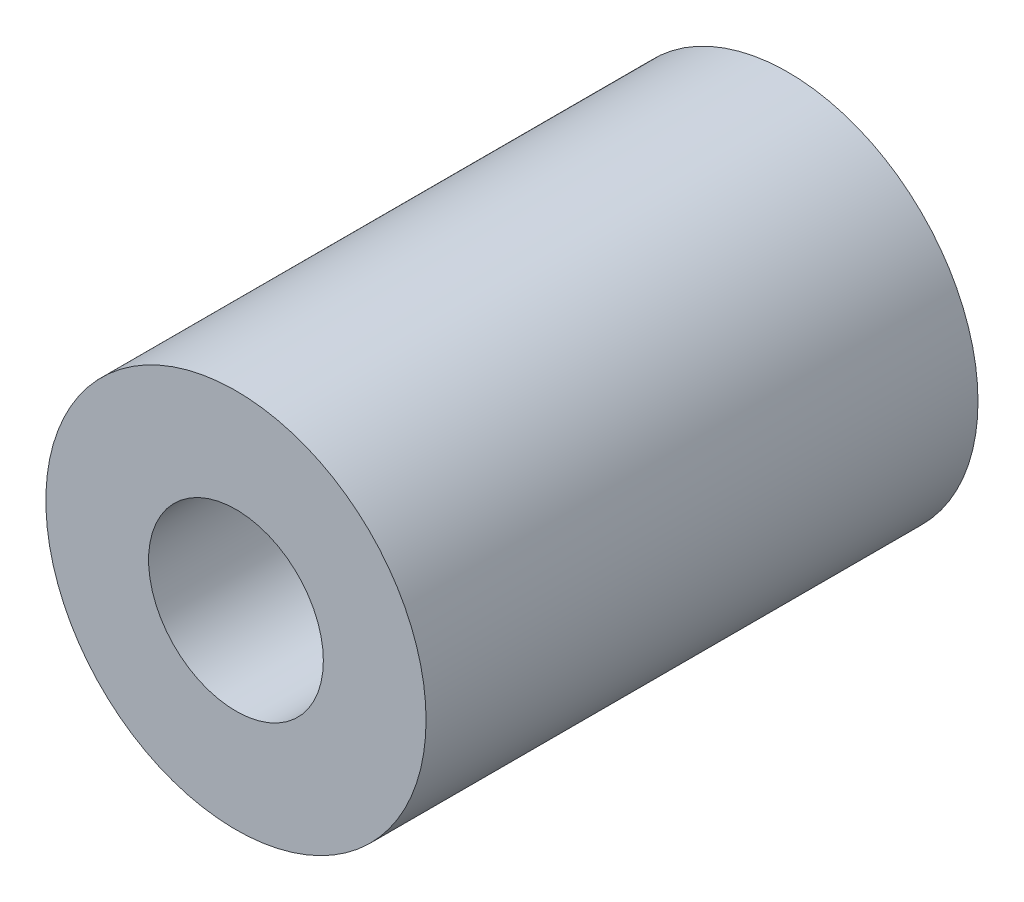
ISO-10303-21;
HEADER;
FILE_DESCRIPTION(('STEP AP214'),'2;1');
FILE_NAME('part.step','',(''),(''),'','','');
FILE_SCHEMA(('AUTOMOTIVE_DESIGN { 1 0 10303 214 1 1 1 1 }'));
ENDSEC;
DATA;
#1=APPLICATION_CONTEXT('core data for automotive mechanical design processes');
#2=APPLICATION_PROTOCOL_DEFINITION('international standard','automotive_design',2000,#1);
#3=PRODUCT_CONTEXT('',#1,'mechanical');
#4=PRODUCT('Part','Part','',(#3));
#5=PRODUCT_RELATED_PRODUCT_CATEGORY('part','',(#4));
#6=PRODUCT_DEFINITION_FORMATION('','',#4);
#7=PRODUCT_DEFINITION_CONTEXT('part definition',#1,'design');
#8=PRODUCT_DEFINITION('design','',#6,#7);
#9=PRODUCT_DEFINITION_SHAPE('','',#8);
#10=(LENGTH_UNIT() NAMED_UNIT(*) SI_UNIT(.MILLI.,.METRE.));
#11=(NAMED_UNIT(*) PLANE_ANGLE_UNIT() SI_UNIT($,.RADIAN.));
#12=(NAMED_UNIT(*) SI_UNIT($,.STERADIAN.) SOLID_ANGLE_UNIT());
#13=UNCERTAINTY_MEASURE_WITH_UNIT(LENGTH_MEASURE(1.E-05),#10,'distance_accuracy_value','');
#14=(GEOMETRIC_REPRESENTATION_CONTEXT(3) GLOBAL_UNCERTAINTY_ASSIGNED_CONTEXT((#13)) GLOBAL_UNIT_ASSIGNED_CONTEXT((#10,
#11,#12)) REPRESENTATION_CONTEXT('',''));
#15=CARTESIAN_POINT('',(0.,0.,0.));
#16=DIRECTION('',(0.,0.,1.));
#17=DIRECTION('',(1.,0.,0.));
#18=AXIS2_PLACEMENT_3D('',#15,#16,#17);
#19=CARTESIAN_POINT('',(0.,0.,9.));
#20=DIRECTION('',(0.,0.,1.));
#21=DIRECTION('',(1.,0.,0.));
#22=AXIS2_PLACEMENT_3D('',#19,#20,#21);
#23=PLANE('',#22);
#24=CARTESIAN_POINT('',(0.,0.,9.));
#25=DIRECTION('',(0.,0.,1.));
#26=DIRECTION('',(1.,0.,0.));
#27=AXIS2_PLACEMENT_3D('',#24,#25,#26);
#28=CIRCLE('',#27,3.1);
#29=CARTESIAN_POINT('',(3.1,0.,9.));
#30=VERTEX_POINT('',#29);
#31=EDGE_CURVE('E10',#30,#30,#28,.T.);
#32=ORIENTED_EDGE('',*,*,#31,.T.);
#33=EDGE_LOOP('',(#32));
#34=FACE_BOUND('',#33,.T.);
#35=CARTESIAN_POINT('',(0.,0.,9.));
#36=DIRECTION('',(0.,0.,1.));
#37=DIRECTION('',(1.,0.,0.));
#38=AXIS2_PLACEMENT_3D('',#35,#36,#37);
#39=CIRCLE('',#38,1.425);
#40=CARTESIAN_POINT('',(1.425,0.,9.));
#41=VERTEX_POINT('',#40);
#42=EDGE_CURVE('E41',#41,#41,#39,.T.);
#43=ORIENTED_EDGE('',*,*,#42,.F.);
#44=EDGE_LOOP('',(#43));
#45=FACE_BOUND('',#44,.T.);
#46=ADVANCED_FACE('F30',(#34,#45),#23,.T.);
#47=CARTESIAN_POINT('',(0.,0.,0.));
#48=DIRECTION('',(0.,0.,1.));
#49=DIRECTION('',(1.,0.,0.));
#50=AXIS2_PLACEMENT_3D('',#47,#48,#49);
#51=PLANE('',#50);
#52=CARTESIAN_POINT('',(0.,0.,0.));
#53=DIRECTION('',(0.,0.,1.));
#54=DIRECTION('',(1.,0.,0.));
#55=AXIS2_PLACEMENT_3D('',#52,#53,#54);
#56=CIRCLE('',#55,3.1);
#57=CARTESIAN_POINT('',(3.1,0.,0.));
#58=VERTEX_POINT('',#57);
#59=EDGE_CURVE('E34',#58,#58,#56,.T.);
#60=ORIENTED_EDGE('',*,*,#59,.F.);
#61=EDGE_LOOP('',(#60));
#62=FACE_BOUND('',#61,.T.);
#63=CARTESIAN_POINT('',(0.,0.,0.));
#64=DIRECTION('',(0.,0.,1.));
#65=DIRECTION('',(1.,0.,0.));
#66=AXIS2_PLACEMENT_3D('',#63,#64,#65);
#67=CIRCLE('',#66,1.425);
#68=CARTESIAN_POINT('',(1.425,0.,0.));
#69=VERTEX_POINT('',#68);
#70=EDGE_CURVE('E43',#69,#69,#67,.T.);
#71=ORIENTED_EDGE('',*,*,#70,.T.);
#72=EDGE_LOOP('',(#71));
#73=FACE_BOUND('',#72,.T.);
#74=ADVANCED_FACE('F53',(#62,#73),#51,.F.);
#75=CARTESIAN_POINT('',(0.,0.,9.));
#76=DIRECTION('',(0.,0.,-1.));
#77=DIRECTION('',(-1.,0.,0.));
#78=AXIS2_PLACEMENT_3D('',#75,#76,#77);
#79=CYLINDRICAL_SURFACE('',#78,3.1);
#80=ORIENTED_EDGE('',*,*,#31,.F.);
#81=EDGE_LOOP('',(#80));
#82=FACE_BOUND('',#81,.T.);
#83=ORIENTED_EDGE('',*,*,#59,.T.);
#84=EDGE_LOOP('',(#83));
#85=FACE_BOUND('',#84,.T.);
#86=ADVANCED_FACE('F32',(#82,#85),#79,.T.);
#87=CARTESIAN_POINT('',(0.,0.,9.));
#88=DIRECTION('',(0.,0.,-1.));
#89=DIRECTION('',(-1.,0.,0.));
#90=AXIS2_PLACEMENT_3D('',#87,#88,#89);
#91=CYLINDRICAL_SURFACE('',#90,1.425);
#92=ORIENTED_EDGE('',*,*,#42,.T.);
#93=EDGE_LOOP('',(#92));
#94=FACE_BOUND('',#93,.T.);
#95=ORIENTED_EDGE('',*,*,#70,.F.);
#96=EDGE_LOOP('',(#95));
#97=FACE_BOUND('',#96,.T.);
#98=ADVANCED_FACE('F49',(#94,#97),#91,.F.);
#99=CLOSED_SHELL('',(#46,#74,#86,#98));
#100=MANIFOLD_SOLID_BREP('B2',#99);
#101=ADVANCED_BREP_SHAPE_REPRESENTATION('',(#18,#100),#14);
#102=SHAPE_DEFINITION_REPRESENTATION(#9,#101);
ENDSEC;
END-ISO-10303-21;
